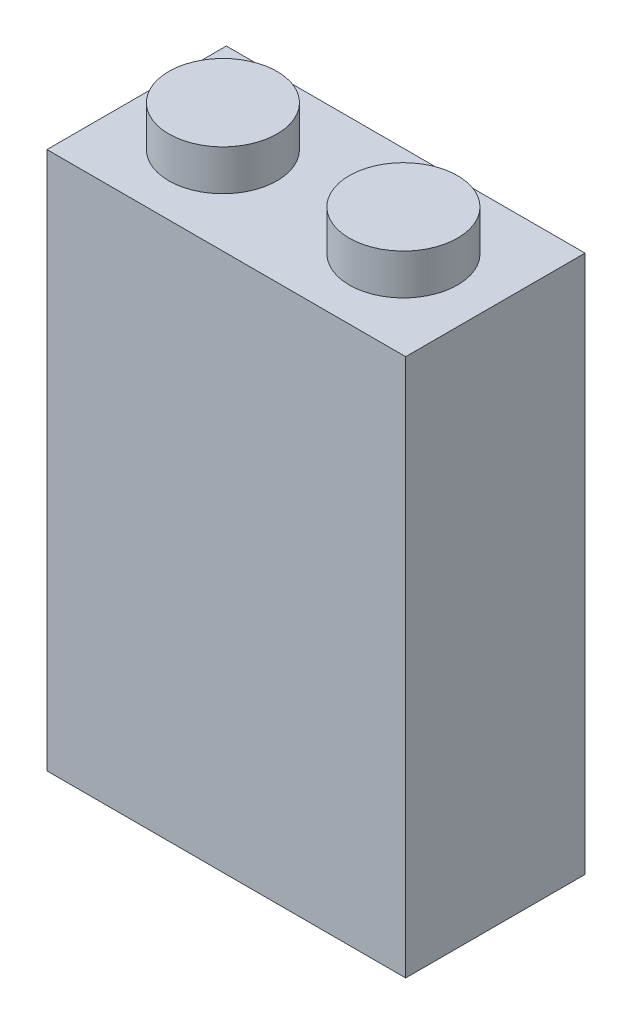
ISO-10303-21;
HEADER;
FILE_DESCRIPTION(('STEP AP214'),'2;1');
FILE_NAME('part.step','',(''),(''),'','','');
FILE_SCHEMA(('AUTOMOTIVE_DESIGN { 1 0 10303 214 1 1 1 1 }'));
ENDSEC;
DATA;
#1=APPLICATION_CONTEXT('core data for automotive mechanical design processes');
#2=APPLICATION_PROTOCOL_DEFINITION('international standard','automotive_design',2000,#1);
#3=PRODUCT_CONTEXT('',#1,'mechanical');
#4=PRODUCT('Part','Part','',(#3));
#5=PRODUCT_RELATED_PRODUCT_CATEGORY('part','',(#4));
#6=PRODUCT_DEFINITION_FORMATION('','',#4);
#7=PRODUCT_DEFINITION_CONTEXT('part definition',#1,'design');
#8=PRODUCT_DEFINITION('design','',#6,#7);
#9=PRODUCT_DEFINITION_SHAPE('','',#8);
#10=(LENGTH_UNIT() NAMED_UNIT(*) SI_UNIT(.MILLI.,.METRE.));
#11=(NAMED_UNIT(*) PLANE_ANGLE_UNIT() SI_UNIT($,.RADIAN.));
#12=(NAMED_UNIT(*) SI_UNIT($,.STERADIAN.) SOLID_ANGLE_UNIT());
#13=UNCERTAINTY_MEASURE_WITH_UNIT(LENGTH_MEASURE(1.E-05),#10,'distance_accuracy_value','');
#14=(GEOMETRIC_REPRESENTATION_CONTEXT(3) GLOBAL_UNCERTAINTY_ASSIGNED_CONTEXT((#13)) GLOBAL_UNIT_ASSIGNED_CONTEXT((#10,
#11,#12)) REPRESENTATION_CONTEXT('',''));
#15=CARTESIAN_POINT('',(0.,0.,0.));
#16=DIRECTION('',(0.,0.,1.));
#17=DIRECTION('',(1.,0.,0.));
#18=AXIS2_PLACEMENT_3D('',#15,#16,#17);
#19=CARTESIAN_POINT('',(-7.95,-11.9249999999999,-7.95));
#20=DIRECTION('',(0.,-1.,0.));
#21=DIRECTION('',(0.,0.,-1.));
#22=AXIS2_PLACEMENT_3D('',#19,#20,#21);
#23=PLANE('',#22);
#24=DIRECTION('',(1.,0.,0.));
#25=VECTOR('',#24,1.);
#26=CARTESIAN_POINT('',(-7.95,-11.9249999999999,0.));
#27=LINE('',#26,#25);
#28=CARTESIAN_POINT('',(-7.95,-11.9249999999999,0.));
#29=VERTEX_POINT('',#28);
#30=CARTESIAN_POINT('',(7.95,-11.9249999999999,0.));
#31=VERTEX_POINT('',#30);
#32=EDGE_CURVE('E175',#29,#31,#27,.T.);
#33=ORIENTED_EDGE('',*,*,#32,.F.);
#34=DIRECTION('',(0.,0.,1.));
#35=VECTOR('',#34,1.);
#36=CARTESIAN_POINT('',(-7.95,-11.9249999999999,-7.95));
#37=LINE('',#36,#35);
#38=CARTESIAN_POINT('',(-7.95,-11.9249999999999,-7.95));
#39=VERTEX_POINT('',#38);
#40=EDGE_CURVE('E43',#39,#29,#37,.T.);
#41=ORIENTED_EDGE('',*,*,#40,.F.);
#42=DIRECTION('',(1.,0.,0.));
#43=VECTOR('',#42,1.);
#44=CARTESIAN_POINT('',(-7.95,-11.9249999999999,-7.95));
#45=LINE('',#44,#43);
#46=CARTESIAN_POINT('',(7.95,-11.9249999999999,-7.95));
#47=VERTEX_POINT('',#46);
#48=EDGE_CURVE('E180',#39,#47,#45,.T.);
#49=ORIENTED_EDGE('',*,*,#48,.T.);
#50=DIRECTION('',(0.,0.,1.));
#51=VECTOR('',#50,1.);
#52=CARTESIAN_POINT('',(7.95,-11.9249999999999,-7.95));
#53=LINE('',#52,#51);
#54=EDGE_CURVE('E11',#47,#31,#53,.T.);
#55=ORIENTED_EDGE('',*,*,#54,.T.);
#56=EDGE_LOOP('',(#33,#41,#49,#55));
#57=FACE_BOUND('',#56,.T.);
#58=DIRECTION('',(0.,0.,1.));
#59=VECTOR('',#58,1.);
#60=CARTESIAN_POINT('',(-6.75,-11.9249999999999,-7.95));
#61=LINE('',#60,#59);
#62=CARTESIAN_POINT('',(-6.75,-11.9249999999999,-6.75));
#63=VERTEX_POINT('',#62);
#64=CARTESIAN_POINT('',(-6.75,-11.9249999999999,-1.2));
#65=VERTEX_POINT('',#64);
#66=EDGE_CURVE('E149',#63,#65,#61,.T.);
#67=ORIENTED_EDGE('',*,*,#66,.T.);
#68=DIRECTION('',(1.,0.,0.));
#69=VECTOR('',#68,1.);
#70=CARTESIAN_POINT('',(-7.95,-11.9249999999999,-1.2));
#71=LINE('',#70,#69);
#72=CARTESIAN_POINT('',(6.75,-11.9249999999999,-1.2));
#73=VERTEX_POINT('',#72);
#74=EDGE_CURVE('E138',#65,#73,#71,.T.);
#75=ORIENTED_EDGE('',*,*,#74,.T.);
#76=DIRECTION('',(0.,0.,1.));
#77=VECTOR('',#76,1.);
#78=CARTESIAN_POINT('',(6.75,-11.9249999999999,-7.95));
#79=LINE('',#78,#77);
#80=CARTESIAN_POINT('',(6.75,-11.9249999999999,-6.75));
#81=VERTEX_POINT('',#80);
#82=EDGE_CURVE('E130',#81,#73,#79,.T.);
#83=ORIENTED_EDGE('',*,*,#82,.F.);
#84=DIRECTION('',(1.,0.,0.));
#85=VECTOR('',#84,1.);
#86=CARTESIAN_POINT('',(-7.95,-11.9249999999999,-6.75));
#87=LINE('',#86,#85);
#88=EDGE_CURVE('E51',#63,#81,#87,.T.);
#89=ORIENTED_EDGE('',*,*,#88,.F.);
#90=EDGE_LOOP('',(#67,#75,#83,#89));
#91=FACE_BOUND('',#90,.T.);
#92=ADVANCED_FACE('F34',(#57,#91),#23,.T.);
#93=CARTESIAN_POINT('',(7.95,-11.9249999999999,-7.95));
#94=DIRECTION('',(1.,0.,0.));
#95=DIRECTION('',(0.,0.,-1.));
#96=AXIS2_PLACEMENT_3D('',#93,#94,#95);
#97=PLANE('',#96);
#98=DIRECTION('',(0.,1.,0.));
#99=VECTOR('',#98,1.);
#100=CARTESIAN_POINT('',(7.95,-11.9249999999999,0.));
#101=LINE('',#100,#99);
#102=CARTESIAN_POINT('',(7.95,11.925,0.));
#103=VERTEX_POINT('',#102);
#104=EDGE_CURVE('E169',#31,#103,#101,.T.);
#105=ORIENTED_EDGE('',*,*,#104,.F.);
#106=ORIENTED_EDGE('',*,*,#54,.F.);
#107=DIRECTION('',(0.,1.,0.));
#108=VECTOR('',#107,1.);
#109=CARTESIAN_POINT('',(7.95,-11.9249999999999,-7.95));
#110=LINE('',#109,#108);
#111=CARTESIAN_POINT('',(7.95,11.925,-7.95));
#112=VERTEX_POINT('',#111);
#113=EDGE_CURVE('E172',#47,#112,#110,.T.);
#114=ORIENTED_EDGE('',*,*,#113,.T.);
#115=DIRECTION('',(0.,0.,1.));
#116=VECTOR('',#115,1.);
#117=CARTESIAN_POINT('',(7.95,11.925,-7.95));
#118=LINE('',#117,#116);
#119=EDGE_CURVE('E38',#112,#103,#118,.T.);
#120=ORIENTED_EDGE('',*,*,#119,.T.);
#121=EDGE_LOOP('',(#105,#106,#114,#120));
#122=FACE_BOUND('',#121,.T.);
#123=ADVANCED_FACE('F36',(#122),#97,.T.);
#124=CARTESIAN_POINT('',(-7.95,-11.9249999999999,-7.95));
#125=DIRECTION('',(-1.,0.,0.));
#126=DIRECTION('',(0.,0.,1.));
#127=AXIS2_PLACEMENT_3D('',#124,#125,#126);
#128=PLANE('',#127);
#129=DIRECTION('',(0.,-1.,0.));
#130=VECTOR('',#129,1.);
#131=CARTESIAN_POINT('',(-7.95,-11.9249999999999,0.));
#132=LINE('',#131,#130);
#133=CARTESIAN_POINT('',(-7.95,11.925,0.));
#134=VERTEX_POINT('',#133);
#135=EDGE_CURVE('E187',#134,#29,#132,.T.);
#136=ORIENTED_EDGE('',*,*,#135,.F.);
#137=DIRECTION('',(0.,0.,1.));
#138=VECTOR('',#137,1.);
#139=CARTESIAN_POINT('',(-7.95,11.925,-7.95));
#140=LINE('',#139,#138);
#141=CARTESIAN_POINT('',(-7.95,11.925,-7.95));
#142=VERTEX_POINT('',#141);
#143=EDGE_CURVE('E192',#142,#134,#140,.T.);
#144=ORIENTED_EDGE('',*,*,#143,.F.);
#145=DIRECTION('',(0.,-1.,0.));
#146=VECTOR('',#145,1.);
#147=CARTESIAN_POINT('',(-7.95,-11.9249999999999,-7.95));
#148=LINE('',#147,#146);
#149=EDGE_CURVE('E177',#142,#39,#148,.T.);
#150=ORIENTED_EDGE('',*,*,#149,.T.);
#151=ORIENTED_EDGE('',*,*,#40,.T.);
#152=EDGE_LOOP('',(#136,#144,#150,#151));
#153=FACE_BOUND('',#152,.T.);
#154=ADVANCED_FACE('F201',(#153),#128,.T.);
#155=CARTESIAN_POINT('',(-7.95,11.925,-7.95));
#156=DIRECTION('',(0.,1.,0.));
#157=DIRECTION('',(0.,0.,1.));
#158=AXIS2_PLACEMENT_3D('',#155,#156,#157);
#159=PLANE('',#158);
#160=CARTESIAN_POINT('',(3.95,11.925,-3.9));
#161=DIRECTION('',(0.,1.,0.));
#162=DIRECTION('',(0.,0.,1.));
#163=AXIS2_PLACEMENT_3D('',#160,#161,#162);
#164=CIRCLE('',#163,2.4);
#165=CARTESIAN_POINT('',(3.95,11.925,-1.5));
#166=VERTEX_POINT('',#165);
#167=EDGE_CURVE('E155',#166,#166,#164,.T.);
#168=ORIENTED_EDGE('',*,*,#167,.F.);
#169=EDGE_LOOP('',(#168));
#170=FACE_BOUND('',#169,.T.);
#171=CARTESIAN_POINT('',(-4.05,11.925,-3.9));
#172=DIRECTION('',(0.,1.,0.));
#173=DIRECTION('',(0.,0.,1.));
#174=AXIS2_PLACEMENT_3D('',#171,#172,#173);
#175=CIRCLE('',#174,2.4);
#176=CARTESIAN_POINT('',(-4.05,11.925,-1.5));
#177=VERTEX_POINT('',#176);
#178=EDGE_CURVE('E165',#177,#177,#175,.T.);
#179=ORIENTED_EDGE('',*,*,#178,.F.);
#180=EDGE_LOOP('',(#179));
#181=FACE_BOUND('',#180,.T.);
#182=DIRECTION('',(-1.,0.,0.));
#183=VECTOR('',#182,1.);
#184=CARTESIAN_POINT('',(-7.95,11.925,0.));
#185=LINE('',#184,#183);
#186=EDGE_CURVE('E184',#103,#134,#185,.T.);
#187=ORIENTED_EDGE('',*,*,#186,.F.);
#188=ORIENTED_EDGE('',*,*,#119,.F.);
#189=DIRECTION('',(-1.,0.,0.));
#190=VECTOR('',#189,1.);
#191=CARTESIAN_POINT('',(-7.95,11.925,-7.95));
#192=LINE('',#191,#190);
#193=EDGE_CURVE('E174',#112,#142,#192,.T.);
#194=ORIENTED_EDGE('',*,*,#193,.T.);
#195=ORIENTED_EDGE('',*,*,#143,.T.);
#196=EDGE_LOOP('',(#187,#188,#194,#195));
#197=FACE_BOUND('',#196,.T.);
#198=ADVANCED_FACE('F194',(#170,#181,#197),#159,.T.);
#199=CARTESIAN_POINT('',(0.,0.,-7.95));
#200=DIRECTION('',(0.,0.,-1.));
#201=DIRECTION('',(-1.,0.,0.));
#202=AXIS2_PLACEMENT_3D('',#199,#200,#201);
#203=PLANE('',#202);
#204=ORIENTED_EDGE('',*,*,#113,.F.);
#205=ORIENTED_EDGE('',*,*,#48,.F.);
#206=ORIENTED_EDGE('',*,*,#149,.F.);
#207=ORIENTED_EDGE('',*,*,#193,.F.);
#208=EDGE_LOOP('',(#204,#205,#206,#207));
#209=FACE_BOUND('',#208,.T.);
#210=ADVANCED_FACE('F203',(#209),#203,.T.);
#211=CARTESIAN_POINT('',(0.,0.,0.));
#212=DIRECTION('',(0.,0.,-1.));
#213=DIRECTION('',(-1.,0.,0.));
#214=AXIS2_PLACEMENT_3D('',#211,#212,#213);
#215=PLANE('',#214);
#216=ORIENTED_EDGE('',*,*,#104,.T.);
#217=ORIENTED_EDGE('',*,*,#186,.T.);
#218=ORIENTED_EDGE('',*,*,#135,.T.);
#219=ORIENTED_EDGE('',*,*,#32,.T.);
#220=EDGE_LOOP('',(#216,#217,#218,#219));
#221=FACE_BOUND('',#220,.T.);
#222=ADVANCED_FACE('F196',(#221),#215,.F.);
#223=CARTESIAN_POINT('',(-4.05,13.725,-3.9));
#224=DIRECTION('',(0.,-1.,0.));
#225=DIRECTION('',(0.,0.,-1.));
#226=AXIS2_PLACEMENT_3D('',#223,#224,#225);
#227=CYLINDRICAL_SURFACE('',#226,2.4);
#228=CARTESIAN_POINT('',(-4.05,13.725,-3.9));
#229=DIRECTION('',(0.,1.,0.));
#230=DIRECTION('',(0.,0.,1.));
#231=AXIS2_PLACEMENT_3D('',#228,#229,#230);
#232=CIRCLE('',#231,2.4);
#233=CARTESIAN_POINT('',(-4.05,13.725,-1.5));
#234=VERTEX_POINT('',#233);
#235=EDGE_CURVE('E166',#234,#234,#232,.T.);
#236=ORIENTED_EDGE('',*,*,#235,.F.);
#237=EDGE_LOOP('',(#236));
#238=FACE_BOUND('',#237,.T.);
#239=ORIENTED_EDGE('',*,*,#178,.T.);
#240=EDGE_LOOP('',(#239));
#241=FACE_BOUND('',#240,.T.);
#242=ADVANCED_FACE('F210',(#238,#241),#227,.T.);
#243=CARTESIAN_POINT('',(-4.05,13.725,-3.9));
#244=DIRECTION('',(0.,1.,0.));
#245=DIRECTION('',(0.,0.,1.));
#246=AXIS2_PLACEMENT_3D('',#243,#244,#245);
#247=PLANE('',#246);
#248=ORIENTED_EDGE('',*,*,#235,.T.);
#249=EDGE_LOOP('',(#248));
#250=FACE_BOUND('',#249,.T.);
#251=ADVANCED_FACE('F236',(#250),#247,.T.);
#252=CARTESIAN_POINT('',(3.95,13.725,-3.9));
#253=DIRECTION('',(0.,-1.,0.));
#254=DIRECTION('',(0.,0.,-1.));
#255=AXIS2_PLACEMENT_3D('',#252,#253,#254);
#256=CYLINDRICAL_SURFACE('',#255,2.4);
#257=CARTESIAN_POINT('',(3.95,13.725,-3.9));
#258=DIRECTION('',(0.,1.,0.));
#259=DIRECTION('',(0.,0.,1.));
#260=AXIS2_PLACEMENT_3D('',#257,#258,#259);
#261=CIRCLE('',#260,2.4);
#262=CARTESIAN_POINT('',(3.95,13.725,-1.5));
#263=VERTEX_POINT('',#262);
#264=EDGE_CURVE('E162',#263,#263,#261,.T.);
#265=ORIENTED_EDGE('',*,*,#264,.F.);
#266=EDGE_LOOP('',(#265));
#267=FACE_BOUND('',#266,.T.);
#268=ORIENTED_EDGE('',*,*,#167,.T.);
#269=EDGE_LOOP('',(#268));
#270=FACE_BOUND('',#269,.T.);
#271=ADVANCED_FACE('F241',(#267,#270),#256,.T.);
#272=CARTESIAN_POINT('',(3.95,13.725,-3.9));
#273=DIRECTION('',(0.,1.,0.));
#274=DIRECTION('',(0.,0.,1.));
#275=AXIS2_PLACEMENT_3D('',#272,#273,#274);
#276=PLANE('',#275);
#277=ORIENTED_EDGE('',*,*,#264,.T.);
#278=EDGE_LOOP('',(#277));
#279=FACE_BOUND('',#278,.T.);
#280=ADVANCED_FACE('F246',(#279),#276,.T.);
#281=CARTESIAN_POINT('',(6.75,-11.9249999999999,-7.95));
#282=DIRECTION('',(1.,0.,0.));
#283=DIRECTION('',(0.,0.,-1.));
#284=AXIS2_PLACEMENT_3D('',#281,#282,#283);
#285=PLANE('',#284);
#286=DIRECTION('',(0.,1.,0.));
#287=VECTOR('',#286,1.);
#288=CARTESIAN_POINT('',(6.75,-11.9249999999999,-1.2));
#289=LINE('',#288,#287);
#290=CARTESIAN_POINT('',(6.75,10.725,-1.2));
#291=VERTEX_POINT('',#290);
#292=EDGE_CURVE('E124',#73,#291,#289,.T.);
#293=ORIENTED_EDGE('',*,*,#292,.T.);
#294=DIRECTION('',(0.,0.,1.));
#295=VECTOR('',#294,1.);
#296=CARTESIAN_POINT('',(6.75,10.725,-7.95));
#297=LINE('',#296,#295);
#298=CARTESIAN_POINT('',(6.75,10.725,-6.75));
#299=VERTEX_POINT('',#298);
#300=EDGE_CURVE('E109',#299,#291,#297,.T.);
#301=ORIENTED_EDGE('',*,*,#300,.F.);
#302=DIRECTION('',(0.,1.,0.));
#303=VECTOR('',#302,1.);
#304=CARTESIAN_POINT('',(6.75,-11.9249999999999,-6.75));
#305=LINE('',#304,#303);
#306=EDGE_CURVE('E137',#81,#299,#305,.T.);
#307=ORIENTED_EDGE('',*,*,#306,.F.);
#308=ORIENTED_EDGE('',*,*,#82,.T.);
#309=EDGE_LOOP('',(#293,#301,#307,#308));
#310=FACE_BOUND('',#309,.T.);
#311=ADVANCED_FACE('F128',(#310),#285,.F.);
#312=CARTESIAN_POINT('',(-6.75,-11.9249999999999,-7.95));
#313=DIRECTION('',(-1.,0.,0.));
#314=DIRECTION('',(0.,0.,1.));
#315=AXIS2_PLACEMENT_3D('',#312,#313,#314);
#316=PLANE('',#315);
#317=DIRECTION('',(0.,-1.,0.));
#318=VECTOR('',#317,1.);
#319=CARTESIAN_POINT('',(-6.75,-11.9249999999999,-1.2));
#320=LINE('',#319,#318);
#321=CARTESIAN_POINT('',(-6.75,10.725,-1.2));
#322=VERTEX_POINT('',#321);
#323=EDGE_CURVE('E126',#322,#65,#320,.T.);
#324=ORIENTED_EDGE('',*,*,#323,.T.);
#325=ORIENTED_EDGE('',*,*,#66,.F.);
#326=DIRECTION('',(0.,-1.,0.));
#327=VECTOR('',#326,1.);
#328=CARTESIAN_POINT('',(-6.75,-11.9249999999999,-6.75));
#329=LINE('',#328,#327);
#330=CARTESIAN_POINT('',(-6.75,10.725,-6.75));
#331=VERTEX_POINT('',#330);
#332=EDGE_CURVE('E147',#331,#63,#329,.T.);
#333=ORIENTED_EDGE('',*,*,#332,.F.);
#334=DIRECTION('',(0.,0.,1.));
#335=VECTOR('',#334,1.);
#336=CARTESIAN_POINT('',(-6.75,10.725,-7.95));
#337=LINE('',#336,#335);
#338=EDGE_CURVE('E117',#331,#322,#337,.T.);
#339=ORIENTED_EDGE('',*,*,#338,.T.);
#340=EDGE_LOOP('',(#324,#325,#333,#339));
#341=FACE_BOUND('',#340,.T.);
#342=ADVANCED_FACE('F269',(#341),#316,.F.);
#343=CARTESIAN_POINT('',(-7.95,10.725,-7.95));
#344=DIRECTION('',(0.,1.,0.));
#345=DIRECTION('',(0.,0.,1.));
#346=AXIS2_PLACEMENT_3D('',#343,#344,#345);
#347=PLANE('',#346);
#348=CARTESIAN_POINT('',(3.95,10.725,-3.9));
#349=DIRECTION('',(0.,1.,0.));
#350=DIRECTION('',(0.,0.,1.));
#351=AXIS2_PLACEMENT_3D('',#348,#349,#350);
#352=CIRCLE('',#351,1.2);
#353=CARTESIAN_POINT('',(3.95,10.725,-2.7));
#354=VERTEX_POINT('',#353);
#355=EDGE_CURVE('E140',#354,#354,#352,.T.);
#356=ORIENTED_EDGE('',*,*,#355,.T.);
#357=EDGE_LOOP('',(#356));
#358=FACE_BOUND('',#357,.T.);
#359=CARTESIAN_POINT('',(-4.05,10.725,-3.9));
#360=DIRECTION('',(0.,1.,0.));
#361=DIRECTION('',(0.,0.,1.));
#362=AXIS2_PLACEMENT_3D('',#359,#360,#361);
#363=CIRCLE('',#362,1.2);
#364=CARTESIAN_POINT('',(-4.05,10.725,-2.7));
#365=VERTEX_POINT('',#364);
#366=EDGE_CURVE('E134',#365,#365,#363,.T.);
#367=ORIENTED_EDGE('',*,*,#366,.T.);
#368=EDGE_LOOP('',(#367));
#369=FACE_BOUND('',#368,.T.);
#370=DIRECTION('',(-1.,0.,0.));
#371=VECTOR('',#370,1.);
#372=CARTESIAN_POINT('',(-7.95,10.725,-1.2));
#373=LINE('',#372,#371);
#374=EDGE_CURVE('E112',#291,#322,#373,.T.);
#375=ORIENTED_EDGE('',*,*,#374,.T.);
#376=ORIENTED_EDGE('',*,*,#338,.F.);
#377=DIRECTION('',(-1.,0.,0.));
#378=VECTOR('',#377,1.);
#379=CARTESIAN_POINT('',(-7.95,10.725,-6.75));
#380=LINE('',#379,#378);
#381=EDGE_CURVE('E114',#299,#331,#380,.T.);
#382=ORIENTED_EDGE('',*,*,#381,.F.);
#383=ORIENTED_EDGE('',*,*,#300,.T.);
#384=EDGE_LOOP('',(#375,#376,#382,#383));
#385=FACE_BOUND('',#384,.T.);
#386=ADVANCED_FACE('F111',(#358,#369,#385),#347,.F.);
#387=CARTESIAN_POINT('',(0.,0.,-6.75));
#388=DIRECTION('',(0.,0.,-1.));
#389=DIRECTION('',(-1.,0.,0.));
#390=AXIS2_PLACEMENT_3D('',#387,#388,#389);
#391=PLANE('',#390);
#392=ORIENTED_EDGE('',*,*,#306,.T.);
#393=ORIENTED_EDGE('',*,*,#381,.T.);
#394=ORIENTED_EDGE('',*,*,#332,.T.);
#395=ORIENTED_EDGE('',*,*,#88,.T.);
#396=EDGE_LOOP('',(#392,#393,#394,#395));
#397=FACE_BOUND('',#396,.T.);
#398=ADVANCED_FACE('F287',(#397),#391,.F.);
#399=CARTESIAN_POINT('',(0.,0.,-1.2));
#400=DIRECTION('',(0.,0.,-1.));
#401=DIRECTION('',(-1.,0.,0.));
#402=AXIS2_PLACEMENT_3D('',#399,#400,#401);
#403=PLANE('',#402);
#404=ORIENTED_EDGE('',*,*,#292,.F.);
#405=ORIENTED_EDGE('',*,*,#74,.F.);
#406=ORIENTED_EDGE('',*,*,#323,.F.);
#407=ORIENTED_EDGE('',*,*,#374,.F.);
#408=EDGE_LOOP('',(#404,#405,#406,#407));
#409=FACE_BOUND('',#408,.T.);
#410=ADVANCED_FACE('F122',(#409),#403,.T.);
#411=CARTESIAN_POINT('',(-4.05,13.725,-3.9));
#412=DIRECTION('',(0.,-1.,0.));
#413=DIRECTION('',(0.,0.,-1.));
#414=AXIS2_PLACEMENT_3D('',#411,#412,#413);
#415=CYLINDRICAL_SURFACE('',#414,1.2);
#416=CARTESIAN_POINT('',(-4.05,12.525,-3.9));
#417=DIRECTION('',(0.,1.,0.));
#418=DIRECTION('',(0.,0.,1.));
#419=AXIS2_PLACEMENT_3D('',#416,#417,#418);
#420=CIRCLE('',#419,1.2);
#421=CARTESIAN_POINT('',(-4.05,12.525,-2.7));
#422=VERTEX_POINT('',#421);
#423=EDGE_CURVE('E131',#422,#422,#420,.T.);
#424=ORIENTED_EDGE('',*,*,#423,.T.);
#425=EDGE_LOOP('',(#424));
#426=FACE_BOUND('',#425,.T.);
#427=ORIENTED_EDGE('',*,*,#366,.F.);
#428=EDGE_LOOP('',(#427));
#429=FACE_BOUND('',#428,.T.);
#430=ADVANCED_FACE('F305',(#426,#429),#415,.F.);
#431=CARTESIAN_POINT('',(-4.05,12.525,-3.9));
#432=DIRECTION('',(0.,1.,0.));
#433=DIRECTION('',(0.,0.,1.));
#434=AXIS2_PLACEMENT_3D('',#431,#432,#433);
#435=PLANE('',#434);
#436=ORIENTED_EDGE('',*,*,#423,.F.);
#437=EDGE_LOOP('',(#436));
#438=FACE_BOUND('',#437,.T.);
#439=ADVANCED_FACE('F314',(#438),#435,.F.);
#440=CARTESIAN_POINT('',(3.95,13.725,-3.9));
#441=DIRECTION('',(0.,-1.,0.));
#442=DIRECTION('',(0.,0.,-1.));
#443=AXIS2_PLACEMENT_3D('',#440,#441,#442);
#444=CYLINDRICAL_SURFACE('',#443,1.2);
#445=CARTESIAN_POINT('',(3.95,12.525,-3.9));
#446=DIRECTION('',(0.,1.,0.));
#447=DIRECTION('',(0.,0.,1.));
#448=AXIS2_PLACEMENT_3D('',#445,#446,#447);
#449=CIRCLE('',#448,1.2);
#450=CARTESIAN_POINT('',(3.95,12.525,-2.7));
#451=VERTEX_POINT('',#450);
#452=EDGE_CURVE('E143',#451,#451,#449,.T.);
#453=ORIENTED_EDGE('',*,*,#452,.T.);
#454=EDGE_LOOP('',(#453));
#455=FACE_BOUND('',#454,.T.);
#456=ORIENTED_EDGE('',*,*,#355,.F.);
#457=EDGE_LOOP('',(#456));
#458=FACE_BOUND('',#457,.T.);
#459=ADVANCED_FACE('F324',(#455,#458),#444,.F.);
#460=CARTESIAN_POINT('',(3.95,12.525,-3.9));
#461=DIRECTION('',(0.,1.,0.));
#462=DIRECTION('',(0.,0.,1.));
#463=AXIS2_PLACEMENT_3D('',#460,#461,#462);
#464=PLANE('',#463);
#465=ORIENTED_EDGE('',*,*,#452,.F.);
#466=EDGE_LOOP('',(#465));
#467=FACE_BOUND('',#466,.T.);
#468=ADVANCED_FACE('F334',(#467),#464,.F.);
#469=CLOSED_SHELL('',(#92,#123,#154,#198,#210,#222,#242,#251,#271,#280,#311,#342,#386,#398,#410,
#430,#439,#459,#468));
#470=MANIFOLD_SOLID_BREP('B2',#469);
#471=ADVANCED_BREP_SHAPE_REPRESENTATION('',(#18,#470),#14);
#472=SHAPE_DEFINITION_REPRESENTATION(#9,#471);
ENDSEC;
END-ISO-10303-21;
